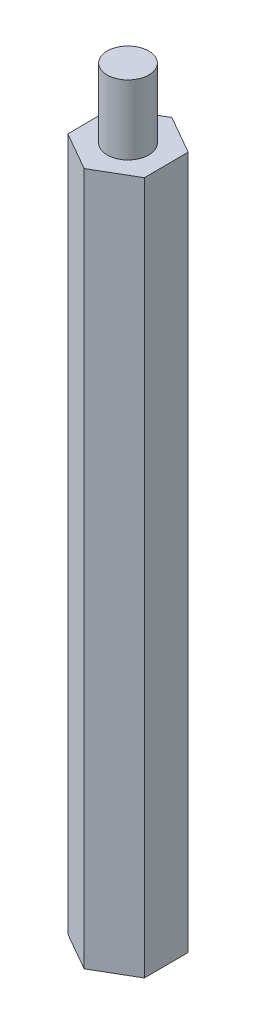
ISO-10303-21;
HEADER;
FILE_DESCRIPTION(('STEP AP214'),'2;1');
FILE_NAME('part.step','',(''),(''),'','','');
FILE_SCHEMA(('AUTOMOTIVE_DESIGN { 1 0 10303 214 1 1 1 1 }'));
ENDSEC;
DATA;
#1=APPLICATION_CONTEXT('core data for automotive mechanical design processes');
#2=APPLICATION_PROTOCOL_DEFINITION('international standard','automotive_design',2000,#1);
#3=PRODUCT_CONTEXT('',#1,'mechanical');
#4=PRODUCT('Part','Part','',(#3));
#5=PRODUCT_RELATED_PRODUCT_CATEGORY('part','',(#4));
#6=PRODUCT_DEFINITION_FORMATION('','',#4);
#7=PRODUCT_DEFINITION_CONTEXT('part definition',#1,'design');
#8=PRODUCT_DEFINITION('design','',#6,#7);
#9=PRODUCT_DEFINITION_SHAPE('','',#8);
#10=(LENGTH_UNIT() NAMED_UNIT(*) SI_UNIT(.MILLI.,.METRE.));
#11=(NAMED_UNIT(*) PLANE_ANGLE_UNIT() SI_UNIT($,.RADIAN.));
#12=(NAMED_UNIT(*) SI_UNIT($,.STERADIAN.) SOLID_ANGLE_UNIT());
#13=UNCERTAINTY_MEASURE_WITH_UNIT(LENGTH_MEASURE(1.E-05),#10,'distance_accuracy_value','');
#14=(GEOMETRIC_REPRESENTATION_CONTEXT(3) GLOBAL_UNCERTAINTY_ASSIGNED_CONTEXT((#13)) GLOBAL_UNIT_ASSIGNED_CONTEXT((#10,
#11,#12)) REPRESENTATION_CONTEXT('',''));
#15=CARTESIAN_POINT('',(0.,0.,0.));
#16=DIRECTION('',(0.,0.,1.));
#17=DIRECTION('',(1.,0.,0.));
#18=AXIS2_PLACEMENT_3D('',#15,#16,#17);
#19=CARTESIAN_POINT('',(2.75647725298331,50.,1.57644108266656));
#20=DIRECTION('',(-0.9999916190243,0.,0.00409412764320857));
#21=DIRECTION('',(0.00409412764320857,0.,0.9999916190243));
#22=AXIS2_PLACEMENT_3D('',#19,#20,#21);
#23=PLANE('',#22);
#24=DIRECTION('',(-0.00409412764320857,0.,-0.9999916190243));
#25=VECTOR('',#24,1.);
#26=CARTESIAN_POINT('',(2.75647725298331,0.,1.57644108266656));
#27=LINE('',#26,#25);
#28=CARTESIAN_POINT('',(2.75647725298331,0.,1.57644108266656));
#29=VERTEX_POINT('',#28);
#30=CARTESIAN_POINT('',(2.74347665165034,0.,-1.59895878470421));
#31=VERTEX_POINT('',#30);
#32=EDGE_CURVE('E119',#29,#31,#27,.T.);
#33=ORIENTED_EDGE('',*,*,#32,.T.);
#34=DIRECTION('',(0.,-1.,0.));
#35=VECTOR('',#34,1.);
#36=CARTESIAN_POINT('',(2.74347665165034,50.,-1.59895878470421));
#37=LINE('',#36,#35);
#38=CARTESIAN_POINT('',(2.74347665165034,50.,-1.59895878470421));
#39=VERTEX_POINT('',#38);
#40=EDGE_CURVE('E36',#39,#31,#37,.T.);
#41=ORIENTED_EDGE('',*,*,#40,.F.);
#42=DIRECTION('',(-0.00409412764320857,0.,-0.9999916190243));
#43=VECTOR('',#42,1.);
#44=CARTESIAN_POINT('',(2.75647725298331,50.,1.57644108266656));
#45=LINE('',#44,#43);
#46=CARTESIAN_POINT('',(2.75647725298331,50.,1.57644108266656));
#47=VERTEX_POINT('',#46);
#48=EDGE_CURVE('E130',#47,#39,#45,.T.);
#49=ORIENTED_EDGE('',*,*,#48,.F.);
#50=DIRECTION('',(0.,-1.,0.));
#51=VECTOR('',#50,1.);
#52=CARTESIAN_POINT('',(2.75647725298331,50.,1.57644108266656));
#53=LINE('',#52,#51);
#54=EDGE_CURVE('E115',#47,#29,#53,.T.);
#55=ORIENTED_EDGE('',*,*,#54,.T.);
#56=EDGE_LOOP('',(#33,#41,#49,#55));
#57=FACE_BOUND('',#56,.T.);
#58=ADVANCED_FACE('F33',(#57),#23,.F.);
#59=CARTESIAN_POINT('',(2.74347665165034,50.,-1.59895878470421));
#60=DIRECTION('',(-0.496450190966795,0.,0.868065209468178));
#61=DIRECTION('',(0.868065209468178,0.,0.496450190966795));
#62=AXIS2_PLACEMENT_3D('',#59,#60,#61);
#63=PLANE('',#62);
#64=DIRECTION('',(-0.868065209468178,0.,-0.496450190966796));
#65=VECTOR('',#64,1.);
#66=CARTESIAN_POINT('',(2.74347665165034,0.,-1.59895878470421));
#67=LINE('',#66,#65);
#68=CARTESIAN_POINT('',(-0.0130006013329671,0.,-3.17539986737077));
#69=VERTEX_POINT('',#68);
#70=EDGE_CURVE('E122',#31,#69,#67,.T.);
#71=ORIENTED_EDGE('',*,*,#70,.T.);
#72=DIRECTION('',(0.,-1.,0.));
#73=VECTOR('',#72,1.);
#74=CARTESIAN_POINT('',(-0.0130006013329671,50.,-3.17539986737077));
#75=LINE('',#74,#73);
#76=CARTESIAN_POINT('',(-0.0130006013329671,50.,-3.17539986737077));
#77=VERTEX_POINT('',#76);
#78=EDGE_CURVE('E133',#77,#69,#75,.T.);
#79=ORIENTED_EDGE('',*,*,#78,.F.);
#80=DIRECTION('',(-0.868065209468178,0.,-0.496450190966796));
#81=VECTOR('',#80,1.);
#82=CARTESIAN_POINT('',(2.74347665165034,50.,-1.59895878470421));
#83=LINE('',#82,#81);
#84=EDGE_CURVE('E88',#39,#77,#83,.T.);
#85=ORIENTED_EDGE('',*,*,#84,.F.);
#86=ORIENTED_EDGE('',*,*,#40,.T.);
#87=EDGE_LOOP('',(#71,#79,#85,#86));
#88=FACE_BOUND('',#87,.T.);
#89=ADVANCED_FACE('F138',(#88),#63,.F.);
#90=CARTESIAN_POINT('',(-0.0130006013329671,50.,-3.17539986737077));
#91=DIRECTION('',(0.503541428057505,0.,0.86397108182497));
#92=DIRECTION('',(0.86397108182497,0.,-0.503541428057505));
#93=AXIS2_PLACEMENT_3D('',#90,#91,#92);
#94=PLANE('',#93);
#95=DIRECTION('',(-0.86397108182497,0.,0.503541428057505));
#96=VECTOR('',#95,1.);
#97=CARTESIAN_POINT('',(-0.0130006013329671,0.,-3.17539986737077));
#98=LINE('',#97,#96);
#99=CARTESIAN_POINT('',(-2.75647725298331,0.,-1.57644108266656));
#100=VERTEX_POINT('',#99);
#101=EDGE_CURVE('E125',#69,#100,#98,.T.);
#102=ORIENTED_EDGE('',*,*,#101,.T.);
#103=DIRECTION('',(0.,-1.,0.));
#104=VECTOR('',#103,1.);
#105=CARTESIAN_POINT('',(-2.75647725298331,50.,-1.57644108266656));
#106=LINE('',#105,#104);
#107=CARTESIAN_POINT('',(-2.75647725298331,50.,-1.57644108266656));
#108=VERTEX_POINT('',#107);
#109=EDGE_CURVE('E110',#108,#100,#106,.T.);
#110=ORIENTED_EDGE('',*,*,#109,.F.);
#111=DIRECTION('',(-0.86397108182497,0.,0.503541428057505));
#112=VECTOR('',#111,1.);
#113=CARTESIAN_POINT('',(-0.0130006013329671,50.,-3.17539986737077));
#114=LINE('',#113,#112);
#115=EDGE_CURVE('E101',#77,#108,#114,.T.);
#116=ORIENTED_EDGE('',*,*,#115,.F.);
#117=ORIENTED_EDGE('',*,*,#78,.T.);
#118=EDGE_LOOP('',(#102,#110,#116,#117));
#119=FACE_BOUND('',#118,.T.);
#120=ADVANCED_FACE('F144',(#119),#94,.F.);
#121=CARTESIAN_POINT('',(-2.75647725298331,50.,-1.57644108266656));
#122=DIRECTION('',(0.9999916190243,0.,-0.00409412764320857));
#123=DIRECTION('',(-0.00409412764320857,0.,-0.9999916190243));
#124=AXIS2_PLACEMENT_3D('',#121,#122,#123);
#125=PLANE('',#124);
#126=DIRECTION('',(0.00409412764320857,0.,0.9999916190243));
#127=VECTOR('',#126,1.);
#128=CARTESIAN_POINT('',(-2.75647725298331,0.,-1.57644108266656));
#129=LINE('',#128,#127);
#130=CARTESIAN_POINT('',(-2.74347665165034,0.,1.59895878470421));
#131=VERTEX_POINT('',#130);
#132=EDGE_CURVE('E109',#100,#131,#129,.T.);
#133=ORIENTED_EDGE('',*,*,#132,.T.);
#134=DIRECTION('',(0.,-1.,0.));
#135=VECTOR('',#134,1.);
#136=CARTESIAN_POINT('',(-2.74347665165034,50.,1.59895878470421));
#137=LINE('',#136,#135);
#138=CARTESIAN_POINT('',(-2.74347665165034,50.,1.59895878470421));
#139=VERTEX_POINT('',#138);
#140=EDGE_CURVE('E106',#139,#131,#137,.T.);
#141=ORIENTED_EDGE('',*,*,#140,.F.);
#142=DIRECTION('',(0.00409412764320857,0.,0.9999916190243));
#143=VECTOR('',#142,1.);
#144=CARTESIAN_POINT('',(-2.75647725298331,50.,-1.57644108266656));
#145=LINE('',#144,#143);
#146=EDGE_CURVE('E95',#108,#139,#145,.T.);
#147=ORIENTED_EDGE('',*,*,#146,.F.);
#148=ORIENTED_EDGE('',*,*,#109,.T.);
#149=EDGE_LOOP('',(#133,#141,#147,#148));
#150=FACE_BOUND('',#149,.T.);
#151=ADVANCED_FACE('F107',(#150),#125,.F.);
#152=CARTESIAN_POINT('',(-2.74347665165034,50.,1.59895878470421));
#153=DIRECTION('',(0.496450190966795,0.,-0.868065209468179));
#154=DIRECTION('',(-0.868065209468179,0.,-0.496450190966795));
#155=AXIS2_PLACEMENT_3D('',#152,#153,#154);
#156=PLANE('',#155);
#157=DIRECTION('',(0.868065209468179,0.,0.496450190966795));
#158=VECTOR('',#157,1.);
#159=CARTESIAN_POINT('',(-2.74347665165034,0.,1.59895878470421));
#160=LINE('',#159,#158);
#161=CARTESIAN_POINT('',(0.013000601332967,0.,3.17539986737077));
#162=VERTEX_POINT('',#161);
#163=EDGE_CURVE('E73',#131,#162,#160,.T.);
#164=ORIENTED_EDGE('',*,*,#163,.T.);
#165=DIRECTION('',(0.,-1.,0.));
#166=VECTOR('',#165,1.);
#167=CARTESIAN_POINT('',(0.013000601332967,50.,3.17539986737077));
#168=LINE('',#167,#166);
#169=CARTESIAN_POINT('',(0.013000601332967,50.,3.17539986737077));
#170=VERTEX_POINT('',#169);
#171=EDGE_CURVE('E111',#170,#162,#168,.T.);
#172=ORIENTED_EDGE('',*,*,#171,.F.);
#173=DIRECTION('',(0.868065209468179,0.,0.496450190966795));
#174=VECTOR('',#173,1.);
#175=CARTESIAN_POINT('',(-2.74347665165034,50.,1.59895878470421));
#176=LINE('',#175,#174);
#177=EDGE_CURVE('E99',#139,#170,#176,.T.);
#178=ORIENTED_EDGE('',*,*,#177,.F.);
#179=ORIENTED_EDGE('',*,*,#140,.T.);
#180=EDGE_LOOP('',(#164,#172,#178,#179));
#181=FACE_BOUND('',#180,.T.);
#182=ADVANCED_FACE('F113',(#181),#156,.F.);
#183=CARTESIAN_POINT('',(0.013000601332967,50.,3.17539986737077));
#184=DIRECTION('',(-0.503541428057505,0.,-0.86397108182497));
#185=DIRECTION('',(-0.86397108182497,0.,0.503541428057505));
#186=AXIS2_PLACEMENT_3D('',#183,#184,#185);
#187=PLANE('',#186);
#188=DIRECTION('',(0.86397108182497,0.,-0.503541428057505));
#189=VECTOR('',#188,1.);
#190=CARTESIAN_POINT('',(0.013000601332967,0.,3.17539986737077));
#191=LINE('',#190,#189);
#192=EDGE_CURVE('E79',#162,#29,#191,.T.);
#193=ORIENTED_EDGE('',*,*,#192,.T.);
#194=ORIENTED_EDGE('',*,*,#54,.F.);
#195=DIRECTION('',(0.86397108182497,0.,-0.503541428057505));
#196=VECTOR('',#195,1.);
#197=CARTESIAN_POINT('',(0.013000601332967,50.,3.17539986737077));
#198=LINE('',#197,#196);
#199=EDGE_CURVE('E50',#170,#47,#198,.T.);
#200=ORIENTED_EDGE('',*,*,#199,.F.);
#201=ORIENTED_EDGE('',*,*,#171,.T.);
#202=EDGE_LOOP('',(#193,#194,#200,#201));
#203=FACE_BOUND('',#202,.T.);
#204=ADVANCED_FACE('F160',(#203),#187,.F.);
#205=CARTESIAN_POINT('',(0.,50.,0.));
#206=DIRECTION('',(0.,1.,0.));
#207=DIRECTION('',(0.,0.,1.));
#208=AXIS2_PLACEMENT_3D('',#205,#206,#207);
#209=PLANE('',#208);
#210=CARTESIAN_POINT('',(0.,50.,0.));
#211=DIRECTION('',(0.,1.,0.));
#212=DIRECTION('',(0.,0.,1.));
#213=AXIS2_PLACEMENT_3D('',#210,#211,#212);
#214=CIRCLE('',#213,1.5);
#215=CARTESIAN_POINT('',(0.,50.,1.5));
#216=VERTEX_POINT('',#215);
#217=EDGE_CURVE('E11',#216,#216,#214,.T.);
#218=ORIENTED_EDGE('',*,*,#217,.F.);
#219=EDGE_LOOP('',(#218));
#220=FACE_BOUND('',#219,.T.);
#221=ORIENTED_EDGE('',*,*,#48,.T.);
#222=ORIENTED_EDGE('',*,*,#84,.T.);
#223=ORIENTED_EDGE('',*,*,#115,.T.);
#224=ORIENTED_EDGE('',*,*,#146,.T.);
#225=ORIENTED_EDGE('',*,*,#177,.T.);
#226=ORIENTED_EDGE('',*,*,#199,.T.);
#227=EDGE_LOOP('',(#221,#222,#223,#224,#225,#226));
#228=FACE_BOUND('',#227,.T.);
#229=ADVANCED_FACE('F97',(#220,#228),#209,.T.);
#230=CARTESIAN_POINT('',(0.,0.,0.));
#231=DIRECTION('',(0.,1.,0.));
#232=DIRECTION('',(0.,0.,1.));
#233=AXIS2_PLACEMENT_3D('',#230,#231,#232);
#234=PLANE('',#233);
#235=ORIENTED_EDGE('',*,*,#32,.F.);
#236=ORIENTED_EDGE('',*,*,#192,.F.);
#237=ORIENTED_EDGE('',*,*,#163,.F.);
#238=ORIENTED_EDGE('',*,*,#132,.F.);
#239=ORIENTED_EDGE('',*,*,#101,.F.);
#240=ORIENTED_EDGE('',*,*,#70,.F.);
#241=EDGE_LOOP('',(#235,#236,#237,#238,#239,#240));
#242=FACE_BOUND('',#241,.T.);
#243=ADVANCED_FACE('F143',(#242),#234,.F.);
#244=CARTESIAN_POINT('',(0.,55.,0.));
#245=DIRECTION('',(0.,-1.,0.));
#246=DIRECTION('',(0.,0.,-1.));
#247=AXIS2_PLACEMENT_3D('',#244,#245,#246);
#248=CYLINDRICAL_SURFACE('',#247,1.5);
#249=CARTESIAN_POINT('',(0.,55.,0.));
#250=DIRECTION('',(0.,1.,0.));
#251=DIRECTION('',(0.,0.,1.));
#252=AXIS2_PLACEMENT_3D('',#249,#250,#251);
#253=CIRCLE('',#252,1.5);
#254=CARTESIAN_POINT('',(0.,55.,1.5));
#255=VERTEX_POINT('',#254);
#256=EDGE_CURVE('E123',#255,#255,#253,.T.);
#257=ORIENTED_EDGE('',*,*,#256,.F.);
#258=EDGE_LOOP('',(#257));
#259=FACE_BOUND('',#258,.T.);
#260=ORIENTED_EDGE('',*,*,#217,.T.);
#261=EDGE_LOOP('',(#260));
#262=FACE_BOUND('',#261,.T.);
#263=ADVANCED_FACE('F153',(#259,#262),#248,.T.);
#264=CARTESIAN_POINT('',(0.,55.,0.));
#265=DIRECTION('',(0.,1.,0.));
#266=DIRECTION('',(0.,0.,1.));
#267=AXIS2_PLACEMENT_3D('',#264,#265,#266);
#268=PLANE('',#267);
#269=ORIENTED_EDGE('',*,*,#256,.T.);
#270=EDGE_LOOP('',(#269));
#271=FACE_BOUND('',#270,.T.);
#272=ADVANCED_FACE('F151',(#271),#268,.T.);
#273=CLOSED_SHELL('',(#58,#89,#120,#151,#182,#204,#229,#243,#263,#272));
#274=MANIFOLD_SOLID_BREP('B2',#273);
#275=ADVANCED_BREP_SHAPE_REPRESENTATION('',(#18,#274),#14);
#276=SHAPE_DEFINITION_REPRESENTATION(#9,#275);
ENDSEC;
END-ISO-10303-21;
